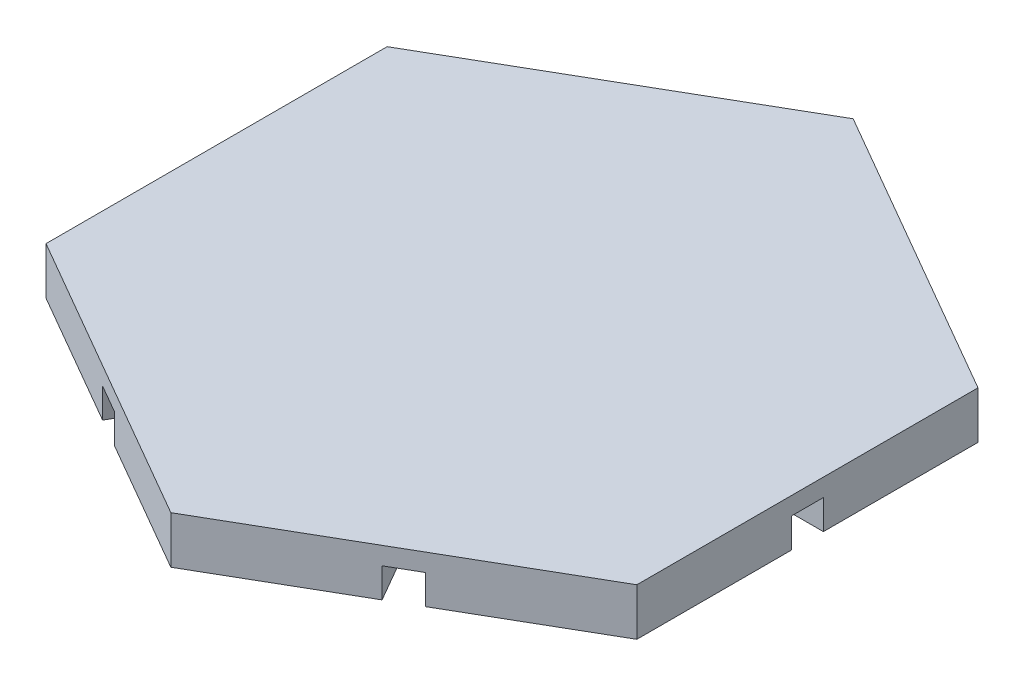
ISO-10303-21;
HEADER;
FILE_DESCRIPTION(('STEP AP214'),'2;1');
FILE_NAME('part.step','',(''),(''),'','','');
FILE_SCHEMA(('AUTOMOTIVE_DESIGN { 1 0 10303 214 1 1 1 1 }'));
ENDSEC;
DATA;
#1=APPLICATION_CONTEXT('core data for automotive mechanical design processes');
#2=APPLICATION_PROTOCOL_DEFINITION('international standard','automotive_design',2000,#1);
#3=PRODUCT_CONTEXT('',#1,'mechanical');
#4=PRODUCT('Part','Part','',(#3));
#5=PRODUCT_RELATED_PRODUCT_CATEGORY('part','',(#4));
#6=PRODUCT_DEFINITION_FORMATION('','',#4);
#7=PRODUCT_DEFINITION_CONTEXT('part definition',#1,'design');
#8=PRODUCT_DEFINITION('design','',#6,#7);
#9=PRODUCT_DEFINITION_SHAPE('','',#8);
#10=(LENGTH_UNIT() NAMED_UNIT(*) SI_UNIT(.MILLI.,.METRE.));
#11=(NAMED_UNIT(*) PLANE_ANGLE_UNIT() SI_UNIT($,.RADIAN.));
#12=(NAMED_UNIT(*) SI_UNIT($,.STERADIAN.) SOLID_ANGLE_UNIT());
#13=UNCERTAINTY_MEASURE_WITH_UNIT(LENGTH_MEASURE(1.E-05),#10,'distance_accuracy_value','');
#14=(GEOMETRIC_REPRESENTATION_CONTEXT(3) GLOBAL_UNCERTAINTY_ASSIGNED_CONTEXT((#13)) GLOBAL_UNIT_ASSIGNED_CONTEXT((#10,
#11,#12)) REPRESENTATION_CONTEXT('',''));
#15=CARTESIAN_POINT('',(0.,0.,0.));
#16=DIRECTION('',(0.,0.,1.));
#17=DIRECTION('',(1.,0.,0.));
#18=AXIS2_PLACEMENT_3D('',#15,#16,#17);
#19=CARTESIAN_POINT('',(25.,8.,43.3012701892219));
#20=DIRECTION('',(-0.499999999999999,0.,-0.866025403784439));
#21=DIRECTION('',(-0.866025403784439,0.,0.499999999999999));
#22=AXIS2_PLACEMENT_3D('',#19,#20,#21);
#23=PLANE('',#22);
#24=DIRECTION('',(0.,-1.,0.));
#25=VECTOR('',#24,1.);
#26=CARTESIAN_POINT('',(27.338268590218,5.,41.9512701892219));
#27=LINE('',#26,#25);
#28=CARTESIAN_POINT('',(27.338268590218,5.,41.9512701892219));
#29=VERTEX_POINT('',#28);
#30=CARTESIAN_POINT('',(27.338268590218,0.,41.9512701892219));
#31=VERTEX_POINT('',#30);
#32=EDGE_CURVE('E300',#29,#31,#27,.T.);
#33=ORIENTED_EDGE('',*,*,#32,.T.);
#34=DIRECTION('',(0.866025403784439,0.,-0.499999999999999));
#35=VECTOR('',#34,1.);
#36=CARTESIAN_POINT('',(25.,0.,43.3012701892219));
#37=LINE('',#36,#35);
#38=CARTESIAN_POINT('',(50.,0.,28.8675134594813));
#39=VERTEX_POINT('',#38);
#40=EDGE_CURVE('E171',#31,#39,#37,.T.);
#41=ORIENTED_EDGE('',*,*,#40,.T.);
#42=DIRECTION('',(0.,-1.,0.));
#43=VECTOR('',#42,1.);
#44=CARTESIAN_POINT('',(50.,8.,28.8675134594813));
#45=LINE('',#44,#43);
#46=CARTESIAN_POINT('',(50.,8.,28.8675134594813));
#47=VERTEX_POINT('',#46);
#48=EDGE_CURVE('E220',#47,#39,#45,.T.);
#49=ORIENTED_EDGE('',*,*,#48,.F.);
#50=DIRECTION('',(0.866025403784439,0.,-0.499999999999999));
#51=VECTOR('',#50,1.);
#52=CARTESIAN_POINT('',(25.,8.,43.3012701892219));
#53=LINE('',#52,#51);
#54=CARTESIAN_POINT('',(0.,8.,57.7350269189626));
#55=VERTEX_POINT('',#54);
#56=EDGE_CURVE('E144',#55,#47,#53,.T.);
#57=ORIENTED_EDGE('',*,*,#56,.F.);
#58=DIRECTION('',(0.,-1.,0.));
#59=VECTOR('',#58,1.);
#60=CARTESIAN_POINT('',(0.,8.,57.7350269189626));
#61=LINE('',#60,#59);
#62=CARTESIAN_POINT('',(0.,0.,57.7350269189626));
#63=VERTEX_POINT('',#62);
#64=EDGE_CURVE('E213',#55,#63,#61,.T.);
#65=ORIENTED_EDGE('',*,*,#64,.T.);
#66=CARTESIAN_POINT('',(22.661731409782,0.,44.6512701892219));
#67=VERTEX_POINT('',#66);
#68=EDGE_CURVE('E247',#63,#67,#37,.T.);
#69=ORIENTED_EDGE('',*,*,#68,.T.);
#70=DIRECTION('',(0.,-1.,0.));
#71=VECTOR('',#70,1.);
#72=CARTESIAN_POINT('',(22.661731409782,5.,44.6512701892219));
#73=LINE('',#72,#71);
#74=CARTESIAN_POINT('',(22.661731409782,5.,44.6512701892219));
#75=VERTEX_POINT('',#74);
#76=EDGE_CURVE('E295',#75,#67,#73,.T.);
#77=ORIENTED_EDGE('',*,*,#76,.F.);
#78=DIRECTION('',(0.866025403784439,0.,-0.499999999999999));
#79=VECTOR('',#78,1.);
#80=CARTESIAN_POINT('',(22.661731409782,5.,44.6512701892219));
#81=LINE('',#80,#79);
#82=EDGE_CURVE('E310',#75,#29,#81,.T.);
#83=ORIENTED_EDGE('',*,*,#82,.T.);
#84=EDGE_LOOP('',(#33,#41,#49,#57,#65,#69,#77,#83));
#85=FACE_BOUND('',#84,.T.);
#86=ADVANCED_FACE('F119',(#85),#23,.F.);
#87=CARTESIAN_POINT('',(0.,0.,0.));
#88=DIRECTION('',(0.,1.,0.));
#89=DIRECTION('',(0.,0.,1.));
#90=AXIS2_PLACEMENT_3D('',#87,#88,#89);
#91=PLANE('',#90);
#92=DIRECTION('',(-0.5,0.,-0.866025403784439));
#93=VECTOR('',#92,1.);
#94=CARTESIAN_POINT('',(27.338268590218,0.,41.9512701892219));
#95=LINE('',#94,#93);
#96=CARTESIAN_POINT('',(4.67653718043595,0.,2.7));
#97=VERTEX_POINT('',#96);
#98=EDGE_CURVE('E283',#31,#97,#95,.T.);
#99=ORIENTED_EDGE('',*,*,#98,.T.);
#100=DIRECTION('',(-1.,0.,0.));
#101=VECTOR('',#100,1.);
#102=CARTESIAN_POINT('',(50.,0.,2.7));
#103=LINE('',#102,#101);
#104=CARTESIAN_POINT('',(50.,0.,2.7));
#105=VERTEX_POINT('',#104);
#106=EDGE_CURVE('E438',#105,#97,#103,.T.);
#107=ORIENTED_EDGE('',*,*,#106,.F.);
#108=DIRECTION('',(0.,0.,-1.));
#109=VECTOR('',#108,1.);
#110=CARTESIAN_POINT('',(50.,0.,0.));
#111=LINE('',#110,#109);
#112=EDGE_CURVE('E224',#39,#105,#111,.T.);
#113=ORIENTED_EDGE('',*,*,#112,.F.);
#114=ORIENTED_EDGE('',*,*,#40,.F.);
#115=EDGE_LOOP('',(#99,#107,#113,#114));
#116=FACE_BOUND('',#115,.T.);
#117=ADVANCED_FACE('F593',(#116),#91,.F.);
#118=DIRECTION('',(0.5,0.,-0.866025403784439));
#119=VECTOR('',#118,1.);
#120=CARTESIAN_POINT('',(-22.661731409782,0.,44.6512701892219));
#121=LINE('',#120,#119);
#122=CARTESIAN_POINT('',(4.67653718043596,0.,-2.7));
#123=VERTEX_POINT('',#122);
#124=CARTESIAN_POINT('',(27.338268590218,0.,-41.9512701892219));
#125=VERTEX_POINT('',#124);
#126=EDGE_CURVE('E348',#123,#125,#121,.T.);
#127=ORIENTED_EDGE('',*,*,#126,.T.);
#128=DIRECTION('',(-0.866025403784438,0.,-0.5));
#129=VECTOR('',#128,1.);
#130=CARTESIAN_POINT('',(25.,0.,-43.3012701892219));
#131=LINE('',#130,#129);
#132=CARTESIAN_POINT('',(50.,0.,-28.8675134594813));
#133=VERTEX_POINT('',#132);
#134=EDGE_CURVE('E230',#133,#125,#131,.T.);
#135=ORIENTED_EDGE('',*,*,#134,.F.);
#136=CARTESIAN_POINT('',(50.,0.,-2.7));
#137=VERTEX_POINT('',#136);
#138=EDGE_CURVE('E229',#137,#133,#111,.T.);
#139=ORIENTED_EDGE('',*,*,#138,.F.);
#140=DIRECTION('',(-1.,0.,0.));
#141=VECTOR('',#140,1.);
#142=CARTESIAN_POINT('',(50.,0.,-2.7));
#143=LINE('',#142,#141);
#144=EDGE_CURVE('E432',#137,#123,#143,.T.);
#145=ORIENTED_EDGE('',*,*,#144,.T.);
#146=EDGE_LOOP('',(#127,#135,#139,#145));
#147=FACE_BOUND('',#146,.T.);
#148=ADVANCED_FACE('F599',(#147),#91,.F.);
#149=CARTESIAN_POINT('',(-22.661731409782,0.,44.6512701892219));
#150=VERTEX_POINT('',#149);
#151=CARTESIAN_POINT('',(0.,0.,5.40000000000001));
#152=VERTEX_POINT('',#151);
#153=EDGE_CURVE('E349',#150,#152,#121,.T.);
#154=ORIENTED_EDGE('',*,*,#153,.T.);
#155=DIRECTION('',(-0.5,0.,-0.866025403784439));
#156=VECTOR('',#155,1.);
#157=CARTESIAN_POINT('',(22.661731409782,0.,44.6512701892219));
#158=LINE('',#157,#156);
#159=EDGE_CURVE('E284',#67,#152,#158,.T.);
#160=ORIENTED_EDGE('',*,*,#159,.F.);
#161=ORIENTED_EDGE('',*,*,#68,.F.);
#162=DIRECTION('',(0.866025403784439,0.,0.5));
#163=VECTOR('',#162,1.);
#164=CARTESIAN_POINT('',(-25.,0.,43.3012701892219));
#165=LINE('',#164,#163);
#166=EDGE_CURVE('E243',#150,#63,#165,.T.);
#167=ORIENTED_EDGE('',*,*,#166,.F.);
#168=EDGE_LOOP('',(#154,#160,#161,#167));
#169=FACE_BOUND('',#168,.T.);
#170=ADVANCED_FACE('F558',(#169),#91,.F.);
#171=CARTESIAN_POINT('',(22.661731409782,0.,-44.651270189222));
#172=VERTEX_POINT('',#171);
#173=CARTESIAN_POINT('',(0.,0.,-57.7350269189626));
#174=VERTEX_POINT('',#173);
#175=EDGE_CURVE('E228',#172,#174,#131,.T.);
#176=ORIENTED_EDGE('',*,*,#175,.F.);
#177=DIRECTION('',(0.5,0.,-0.866025403784439));
#178=VECTOR('',#177,1.);
#179=CARTESIAN_POINT('',(-27.338268590218,0.,41.9512701892219));
#180=LINE('',#179,#178);
#181=CARTESIAN_POINT('',(0.,0.,-5.39999999999999));
#182=VERTEX_POINT('',#181);
#183=EDGE_CURVE('E275',#182,#172,#180,.T.);
#184=ORIENTED_EDGE('',*,*,#183,.F.);
#185=CARTESIAN_POINT('',(-22.661731409782,0.,-44.651270189222));
#186=VERTEX_POINT('',#185);
#187=EDGE_CURVE('E272',#182,#186,#95,.T.);
#188=ORIENTED_EDGE('',*,*,#187,.T.);
#189=DIRECTION('',(-0.866025403784439,0.,0.5));
#190=VECTOR('',#189,1.);
#191=CARTESIAN_POINT('',(-25.,0.,-43.3012701892219));
#192=LINE('',#191,#190);
#193=EDGE_CURVE('E235',#174,#186,#192,.T.);
#194=ORIENTED_EDGE('',*,*,#193,.F.);
#195=EDGE_LOOP('',(#176,#184,#188,#194));
#196=FACE_BOUND('',#195,.T.);
#197=ADVANCED_FACE('F268',(#196),#91,.F.);
#198=CARTESIAN_POINT('',(-4.67653718043598,0.,2.7));
#199=VERTEX_POINT('',#198);
#200=CARTESIAN_POINT('',(-50.,0.,2.7));
#201=VERTEX_POINT('',#200);
#202=EDGE_CURVE('E442',#199,#201,#103,.T.);
#203=ORIENTED_EDGE('',*,*,#202,.F.);
#204=CARTESIAN_POINT('',(-27.338268590218,0.,41.9512701892219));
#205=VERTEX_POINT('',#204);
#206=EDGE_CURVE('E344',#205,#199,#180,.T.);
#207=ORIENTED_EDGE('',*,*,#206,.F.);
#208=CARTESIAN_POINT('',(-50.,0.,28.8675134594813));
#209=VERTEX_POINT('',#208);
#210=EDGE_CURVE('E244',#209,#205,#165,.T.);
#211=ORIENTED_EDGE('',*,*,#210,.F.);
#212=DIRECTION('',(0.,0.,1.));
#213=VECTOR('',#212,1.);
#214=CARTESIAN_POINT('',(-50.,0.,0.));
#215=LINE('',#214,#213);
#216=EDGE_CURVE('E207',#201,#209,#215,.T.);
#217=ORIENTED_EDGE('',*,*,#216,.F.);
#218=EDGE_LOOP('',(#203,#207,#211,#217));
#219=FACE_BOUND('',#218,.T.);
#220=ADVANCED_FACE('F565',(#219),#91,.F.);
#221=CARTESIAN_POINT('',(50.,8.,0.));
#222=DIRECTION('',(-1.,0.,0.));
#223=DIRECTION('',(0.,0.,1.));
#224=AXIS2_PLACEMENT_3D('',#221,#222,#223);
#225=PLANE('',#224);
#226=ORIENTED_EDGE('',*,*,#112,.T.);
#227=DIRECTION('',(0.,-1.,0.));
#228=VECTOR('',#227,1.);
#229=CARTESIAN_POINT('',(50.,5.,2.7));
#230=LINE('',#229,#228);
#231=CARTESIAN_POINT('',(50.,5.,2.7));
#232=VERTEX_POINT('',#231);
#233=EDGE_CURVE('E418',#232,#105,#230,.T.);
#234=ORIENTED_EDGE('',*,*,#233,.F.);
#235=DIRECTION('',(0.,0.,-1.));
#236=VECTOR('',#235,1.);
#237=CARTESIAN_POINT('',(50.,5.,2.7));
#238=LINE('',#237,#236);
#239=CARTESIAN_POINT('',(50.,5.,-2.7));
#240=VERTEX_POINT('',#239);
#241=EDGE_CURVE('E422',#232,#240,#238,.T.);
#242=ORIENTED_EDGE('',*,*,#241,.T.);
#243=DIRECTION('',(0.,-1.,0.));
#244=VECTOR('',#243,1.);
#245=CARTESIAN_POINT('',(50.,5.,-2.7));
#246=LINE('',#245,#244);
#247=EDGE_CURVE('E425',#240,#137,#246,.T.);
#248=ORIENTED_EDGE('',*,*,#247,.T.);
#249=ORIENTED_EDGE('',*,*,#138,.T.);
#250=DIRECTION('',(0.,-1.,0.));
#251=VECTOR('',#250,1.);
#252=CARTESIAN_POINT('',(50.,8.,-28.8675134594813));
#253=LINE('',#252,#251);
#254=CARTESIAN_POINT('',(50.,8.,-28.8675134594813));
#255=VERTEX_POINT('',#254);
#256=EDGE_CURVE('E12',#255,#133,#253,.T.);
#257=ORIENTED_EDGE('',*,*,#256,.F.);
#258=DIRECTION('',(0.,0.,-1.));
#259=VECTOR('',#258,1.);
#260=CARTESIAN_POINT('',(50.,8.,0.));
#261=LINE('',#260,#259);
#262=EDGE_CURVE('E251',#47,#255,#261,.T.);
#263=ORIENTED_EDGE('',*,*,#262,.F.);
#264=ORIENTED_EDGE('',*,*,#48,.T.);
#265=EDGE_LOOP('',(#226,#234,#242,#248,#249,#257,#263,#264));
#266=FACE_BOUND('',#265,.T.);
#267=ADVANCED_FACE('F121',(#266),#225,.F.);
#268=CARTESIAN_POINT('',(25.,8.,-43.3012701892219));
#269=DIRECTION('',(-0.5,0.,0.866025403784438));
#270=DIRECTION('',(0.866025403784438,0.,0.5));
#271=AXIS2_PLACEMENT_3D('',#268,#269,#270);
#272=PLANE('',#271);
#273=DIRECTION('',(-0.866025403784438,0.,-0.500000000000001));
#274=VECTOR('',#273,1.);
#275=CARTESIAN_POINT('',(27.338268590218,5.,-41.9512701892219));
#276=LINE('',#275,#274);
#277=CARTESIAN_POINT('',(27.338268590218,5.,-41.9512701892219));
#278=VERTEX_POINT('',#277);
#279=CARTESIAN_POINT('',(22.661731409782,5.,-44.651270189222));
#280=VERTEX_POINT('',#279);
#281=EDGE_CURVE('E329',#278,#280,#276,.T.);
#282=ORIENTED_EDGE('',*,*,#281,.T.);
#283=DIRECTION('',(0.,-1.,0.));
#284=VECTOR('',#283,1.);
#285=CARTESIAN_POINT('',(22.661731409782,5.,-44.651270189222));
#286=LINE('',#285,#284);
#287=EDGE_CURVE('E343',#280,#172,#286,.T.);
#288=ORIENTED_EDGE('',*,*,#287,.T.);
#289=ORIENTED_EDGE('',*,*,#175,.T.);
#290=DIRECTION('',(0.,-1.,0.));
#291=VECTOR('',#290,1.);
#292=CARTESIAN_POINT('',(0.,8.,-57.7350269189626));
#293=LINE('',#292,#291);
#294=CARTESIAN_POINT('',(0.,8.,-57.7350269189626));
#295=VERTEX_POINT('',#294);
#296=EDGE_CURVE('E128',#295,#174,#293,.T.);
#297=ORIENTED_EDGE('',*,*,#296,.F.);
#298=DIRECTION('',(-0.866025403784438,0.,-0.5));
#299=VECTOR('',#298,1.);
#300=CARTESIAN_POINT('',(25.,8.,-43.3012701892219));
#301=LINE('',#300,#299);
#302=EDGE_CURVE('E179',#255,#295,#301,.T.);
#303=ORIENTED_EDGE('',*,*,#302,.F.);
#304=ORIENTED_EDGE('',*,*,#256,.T.);
#305=ORIENTED_EDGE('',*,*,#134,.T.);
#306=DIRECTION('',(0.,-1.,0.));
#307=VECTOR('',#306,1.);
#308=CARTESIAN_POINT('',(27.338268590218,5.,-41.9512701892219));
#309=LINE('',#308,#307);
#310=EDGE_CURVE('E361',#278,#125,#309,.T.);
#311=ORIENTED_EDGE('',*,*,#310,.F.);
#312=EDGE_LOOP('',(#282,#288,#289,#297,#303,#304,#305,#311));
#313=FACE_BOUND('',#312,.T.);
#314=ADVANCED_FACE('F609',(#313),#272,.F.);
#315=CARTESIAN_POINT('',(-25.,8.,-43.3012701892219));
#316=DIRECTION('',(0.5,0.,0.866025403784439));
#317=DIRECTION('',(0.866025403784439,0.,-0.5));
#318=AXIS2_PLACEMENT_3D('',#315,#316,#317);
#319=PLANE('',#318);
#320=DIRECTION('',(-0.866025403784439,0.,0.499999999999999));
#321=VECTOR('',#320,1.);
#322=CARTESIAN_POINT('',(-22.661731409782,5.,-44.651270189222));
#323=LINE('',#322,#321);
#324=CARTESIAN_POINT('',(-22.661731409782,5.,-44.651270189222));
#325=VERTEX_POINT('',#324);
#326=CARTESIAN_POINT('',(-27.338268590218,5.,-41.951270189222));
#327=VERTEX_POINT('',#326);
#328=EDGE_CURVE('E395',#325,#327,#323,.T.);
#329=ORIENTED_EDGE('',*,*,#328,.T.);
#330=DIRECTION('',(0.,-1.,0.));
#331=VECTOR('',#330,1.);
#332=CARTESIAN_POINT('',(-27.338268590218,5.,-41.951270189222));
#333=LINE('',#332,#331);
#334=CARTESIAN_POINT('',(-27.338268590218,0.,-41.951270189222));
#335=VERTEX_POINT('',#334);
#336=EDGE_CURVE('E306',#327,#335,#333,.T.);
#337=ORIENTED_EDGE('',*,*,#336,.T.);
#338=CARTESIAN_POINT('',(-50.,0.,-28.8675134594813));
#339=VERTEX_POINT('',#338);
#340=EDGE_CURVE('E234',#335,#339,#192,.T.);
#341=ORIENTED_EDGE('',*,*,#340,.T.);
#342=DIRECTION('',(0.,-1.,0.));
#343=VECTOR('',#342,1.);
#344=CARTESIAN_POINT('',(-50.,8.,-28.8675134594813));
#345=LINE('',#344,#343);
#346=CARTESIAN_POINT('',(-50.,8.,-28.8675134594813));
#347=VERTEX_POINT('',#346);
#348=EDGE_CURVE('E212',#347,#339,#345,.T.);
#349=ORIENTED_EDGE('',*,*,#348,.F.);
#350=DIRECTION('',(-0.866025403784439,0.,0.5));
#351=VECTOR('',#350,1.);
#352=CARTESIAN_POINT('',(-25.,8.,-43.3012701892219));
#353=LINE('',#352,#351);
#354=EDGE_CURVE('E195',#295,#347,#353,.T.);
#355=ORIENTED_EDGE('',*,*,#354,.F.);
#356=ORIENTED_EDGE('',*,*,#296,.T.);
#357=ORIENTED_EDGE('',*,*,#193,.T.);
#358=DIRECTION('',(0.,-1.,0.));
#359=VECTOR('',#358,1.);
#360=CARTESIAN_POINT('',(-22.661731409782,5.,-44.651270189222));
#361=LINE('',#360,#359);
#362=EDGE_CURVE('E303',#325,#186,#361,.T.);
#363=ORIENTED_EDGE('',*,*,#362,.F.);
#364=EDGE_LOOP('',(#329,#337,#341,#349,#355,#356,#357,#363));
#365=FACE_BOUND('',#364,.T.);
#366=ADVANCED_FACE('F262',(#365),#319,.F.);
#367=CARTESIAN_POINT('',(-50.,8.,0.));
#368=DIRECTION('',(1.,0.,0.));
#369=DIRECTION('',(0.,0.,-1.));
#370=AXIS2_PLACEMENT_3D('',#367,#368,#369);
#371=PLANE('',#370);
#372=DIRECTION('',(0.,0.,1.));
#373=VECTOR('',#372,1.);
#374=CARTESIAN_POINT('',(-50.,5.,-2.7));
#375=LINE('',#374,#373);
#376=CARTESIAN_POINT('',(-50.,5.,-2.7));
#377=VERTEX_POINT('',#376);
#378=CARTESIAN_POINT('',(-50.,5.,2.7));
#379=VERTEX_POINT('',#378);
#380=EDGE_CURVE('E451',#377,#379,#375,.T.);
#381=ORIENTED_EDGE('',*,*,#380,.T.);
#382=DIRECTION('',(0.,-1.,0.));
#383=VECTOR('',#382,1.);
#384=CARTESIAN_POINT('',(-50.,5.,2.7));
#385=LINE('',#384,#383);
#386=EDGE_CURVE('E419',#379,#201,#385,.T.);
#387=ORIENTED_EDGE('',*,*,#386,.T.);
#388=ORIENTED_EDGE('',*,*,#216,.T.);
#389=DIRECTION('',(0.,-1.,0.));
#390=VECTOR('',#389,1.);
#391=CARTESIAN_POINT('',(-50.,8.,28.8675134594813));
#392=LINE('',#391,#390);
#393=CARTESIAN_POINT('',(-50.,8.,28.8675134594813));
#394=VERTEX_POINT('',#393);
#395=EDGE_CURVE('E202',#394,#209,#392,.T.);
#396=ORIENTED_EDGE('',*,*,#395,.F.);
#397=DIRECTION('',(0.,0.,1.));
#398=VECTOR('',#397,1.);
#399=CARTESIAN_POINT('',(-50.,8.,0.));
#400=LINE('',#399,#398);
#401=EDGE_CURVE('E188',#347,#394,#400,.T.);
#402=ORIENTED_EDGE('',*,*,#401,.F.);
#403=ORIENTED_EDGE('',*,*,#348,.T.);
#404=CARTESIAN_POINT('',(-50.,0.,-2.7));
#405=VERTEX_POINT('',#404);
#406=EDGE_CURVE('E239',#339,#405,#215,.T.);
#407=ORIENTED_EDGE('',*,*,#406,.T.);
#408=DIRECTION('',(0.,-1.,0.));
#409=VECTOR('',#408,1.);
#410=CARTESIAN_POINT('',(-50.,5.,-2.7));
#411=LINE('',#410,#409);
#412=EDGE_CURVE('E135',#377,#405,#411,.T.);
#413=ORIENTED_EDGE('',*,*,#412,.F.);
#414=EDGE_LOOP('',(#381,#387,#388,#396,#402,#403,#407,#413));
#415=FACE_BOUND('',#414,.T.);
#416=ADVANCED_FACE('F204',(#415),#371,.F.);
#417=CARTESIAN_POINT('',(-25.,8.,43.3012701892219));
#418=DIRECTION('',(0.5,0.,-0.866025403784439));
#419=DIRECTION('',(-0.866025403784439,0.,-0.5));
#420=AXIS2_PLACEMENT_3D('',#417,#418,#419);
#421=PLANE('',#420);
#422=ORIENTED_EDGE('',*,*,#210,.T.);
#423=DIRECTION('',(0.,-1.,0.));
#424=VECTOR('',#423,1.);
#425=CARTESIAN_POINT('',(-27.338268590218,5.,41.9512701892219));
#426=LINE('',#425,#424);
#427=CARTESIAN_POINT('',(-27.338268590218,5.,41.9512701892219));
#428=VERTEX_POINT('',#427);
#429=EDGE_CURVE('E353',#428,#205,#426,.T.);
#430=ORIENTED_EDGE('',*,*,#429,.F.);
#431=DIRECTION('',(0.866025403784438,0.,0.500000000000001));
#432=VECTOR('',#431,1.);
#433=CARTESIAN_POINT('',(-27.338268590218,5.,41.9512701892219));
#434=LINE('',#433,#432);
#435=CARTESIAN_POINT('',(-22.661731409782,5.,44.6512701892219));
#436=VERTEX_POINT('',#435);
#437=EDGE_CURVE('E339',#428,#436,#434,.T.);
#438=ORIENTED_EDGE('',*,*,#437,.T.);
#439=DIRECTION('',(0.,-1.,0.));
#440=VECTOR('',#439,1.);
#441=CARTESIAN_POINT('',(-22.661731409782,5.,44.6512701892219));
#442=LINE('',#441,#440);
#443=EDGE_CURVE('E357',#436,#150,#442,.T.);
#444=ORIENTED_EDGE('',*,*,#443,.T.);
#445=ORIENTED_EDGE('',*,*,#166,.T.);
#446=ORIENTED_EDGE('',*,*,#64,.F.);
#447=DIRECTION('',(0.866025403784439,0.,0.5));
#448=VECTOR('',#447,1.);
#449=CARTESIAN_POINT('',(-25.,8.,43.3012701892219));
#450=LINE('',#449,#448);
#451=EDGE_CURVE('E192',#394,#55,#450,.T.);
#452=ORIENTED_EDGE('',*,*,#451,.F.);
#453=ORIENTED_EDGE('',*,*,#395,.T.);
#454=EDGE_LOOP('',(#422,#430,#438,#444,#445,#446,#452,#453));
#455=FACE_BOUND('',#454,.T.);
#456=ADVANCED_FACE('F215',(#455),#421,.F.);
#457=CARTESIAN_POINT('',(0.,8.,0.));
#458=DIRECTION('',(0.,1.,0.));
#459=DIRECTION('',(0.,0.,1.));
#460=AXIS2_PLACEMENT_3D('',#457,#458,#459);
#461=PLANE('',#460);
#462=ORIENTED_EDGE('',*,*,#262,.T.);
#463=ORIENTED_EDGE('',*,*,#302,.T.);
#464=ORIENTED_EDGE('',*,*,#354,.T.);
#465=ORIENTED_EDGE('',*,*,#401,.T.);
#466=ORIENTED_EDGE('',*,*,#451,.T.);
#467=ORIENTED_EDGE('',*,*,#56,.T.);
#468=EDGE_LOOP('',(#462,#463,#464,#465,#466,#467));
#469=FACE_BOUND('',#468,.T.);
#470=ADVANCED_FACE('F190',(#469),#461,.T.);
#471=ORIENTED_EDGE('',*,*,#340,.F.);
#472=CARTESIAN_POINT('',(-4.67653718043598,0.,-2.7));
#473=VERTEX_POINT('',#472);
#474=EDGE_CURVE('E291',#473,#335,#158,.T.);
#475=ORIENTED_EDGE('',*,*,#474,.F.);
#476=EDGE_CURVE('E437',#473,#405,#143,.T.);
#477=ORIENTED_EDGE('',*,*,#476,.T.);
#478=ORIENTED_EDGE('',*,*,#406,.F.);
#479=EDGE_LOOP('',(#471,#475,#477,#478));
#480=FACE_BOUND('',#479,.T.);
#481=ADVANCED_FACE('F571',(#480),#91,.F.);
#482=CARTESIAN_POINT('',(-27.338268590218,5.,41.9512701892219));
#483=DIRECTION('',(-0.866025403784438,0.,-0.5));
#484=DIRECTION('',(-0.5,0.,0.866025403784438));
#485=AXIS2_PLACEMENT_3D('',#482,#483,#484);
#486=PLANE('',#485);
#487=ORIENTED_EDGE('',*,*,#183,.T.);
#488=ORIENTED_EDGE('',*,*,#287,.F.);
#489=DIRECTION('',(0.5,0.,-0.866025403784439));
#490=VECTOR('',#489,1.);
#491=CARTESIAN_POINT('',(-27.338268590218,5.,41.9512701892219));
#492=LINE('',#491,#490);
#493=CARTESIAN_POINT('',(0.,5.,-5.39999999999999));
#494=VERTEX_POINT('',#493);
#495=EDGE_CURVE('E330',#494,#280,#492,.T.);
#496=ORIENTED_EDGE('',*,*,#495,.F.);
#497=DIRECTION('',(0.,1.,0.));
#498=VECTOR('',#497,1.);
#499=CARTESIAN_POINT('',(0.,5.,-5.4));
#500=LINE('',#499,#498);
#501=EDGE_CURVE('E322',#182,#494,#500,.T.);
#502=ORIENTED_EDGE('',*,*,#501,.F.);
#503=EDGE_LOOP('',(#487,#488,#496,#502));
#504=FACE_BOUND('',#503,.T.);
#505=ADVANCED_FACE('F704',(#504),#486,.F.);
#506=CARTESIAN_POINT('',(-22.661731409782,5.,44.6512701892219));
#507=DIRECTION('',(-0.866025403784438,0.,-0.5));
#508=DIRECTION('',(-0.5,0.,0.866025403784438));
#509=AXIS2_PLACEMENT_3D('',#506,#507,#508);
#510=PLANE('',#509);
#511=DIRECTION('',(0.,1.,0.));
#512=VECTOR('',#511,1.);
#513=CARTESIAN_POINT('',(4.67653718043596,5.,-2.7));
#514=LINE('',#513,#512);
#515=CARTESIAN_POINT('',(4.67653718043595,5.,-2.7));
#516=VERTEX_POINT('',#515);
#517=EDGE_CURVE('E314',#123,#516,#514,.T.);
#518=ORIENTED_EDGE('',*,*,#517,.T.);
#519=DIRECTION('',(0.5,0.,-0.866025403784439));
#520=VECTOR('',#519,1.);
#521=CARTESIAN_POINT('',(-22.661731409782,5.,44.6512701892219));
#522=LINE('',#521,#520);
#523=EDGE_CURVE('E334',#516,#278,#522,.T.);
#524=ORIENTED_EDGE('',*,*,#523,.T.);
#525=ORIENTED_EDGE('',*,*,#310,.T.);
#526=ORIENTED_EDGE('',*,*,#126,.F.);
#527=EDGE_LOOP('',(#518,#524,#525,#526));
#528=FACE_BOUND('',#527,.T.);
#529=ADVANCED_FACE('F619',(#528),#510,.T.);
#530=DIRECTION('',(0.,1.,0.));
#531=VECTOR('',#530,1.);
#532=CARTESIAN_POINT('',(-4.67653718043598,5.,2.7));
#533=LINE('',#532,#531);
#534=CARTESIAN_POINT('',(-4.67653718043598,5.,2.7));
#535=VERTEX_POINT('',#534);
#536=EDGE_CURVE('E299',#199,#535,#533,.T.);
#537=ORIENTED_EDGE('',*,*,#536,.T.);
#538=EDGE_CURVE('E325',#428,#535,#492,.T.);
#539=ORIENTED_EDGE('',*,*,#538,.F.);
#540=ORIENTED_EDGE('',*,*,#429,.T.);
#541=ORIENTED_EDGE('',*,*,#206,.T.);
#542=EDGE_LOOP('',(#537,#539,#540,#541));
#543=FACE_BOUND('',#542,.T.);
#544=ADVANCED_FACE('F562',(#543),#486,.F.);
#545=ORIENTED_EDGE('',*,*,#153,.F.);
#546=ORIENTED_EDGE('',*,*,#443,.F.);
#547=CARTESIAN_POINT('',(0.,5.,5.40000000000001));
#548=VERTEX_POINT('',#547);
#549=EDGE_CURVE('E335',#436,#548,#522,.T.);
#550=ORIENTED_EDGE('',*,*,#549,.T.);
#551=DIRECTION('',(0.,1.,0.));
#552=VECTOR('',#551,1.);
#553=CARTESIAN_POINT('',(0.,5.,5.4));
#554=LINE('',#553,#552);
#555=EDGE_CURVE('E318',#152,#548,#554,.T.);
#556=ORIENTED_EDGE('',*,*,#555,.F.);
#557=EDGE_LOOP('',(#545,#546,#550,#556));
#558=FACE_BOUND('',#557,.T.);
#559=ADVANCED_FACE('F555',(#558),#510,.T.);
#560=CARTESIAN_POINT('',(0.,5.,0.));
#561=DIRECTION('',(0.,1.,0.));
#562=DIRECTION('',(-1.,0.,0.));
#563=AXIS2_PLACEMENT_3D('',#560,#561,#562);
#564=PLANE('',#563);
#565=ORIENTED_EDGE('',*,*,#549,.F.);
#566=ORIENTED_EDGE('',*,*,#437,.F.);
#567=ORIENTED_EDGE('',*,*,#538,.T.);
#568=DIRECTION('',(-1.,0.,0.));
#569=VECTOR('',#568,1.);
#570=CARTESIAN_POINT('',(50.,5.,2.7));
#571=LINE('',#570,#569);
#572=EDGE_CURVE('E436',#535,#379,#571,.T.);
#573=ORIENTED_EDGE('',*,*,#572,.T.);
#574=ORIENTED_EDGE('',*,*,#380,.F.);
#575=DIRECTION('',(-1.,0.,0.));
#576=VECTOR('',#575,1.);
#577=CARTESIAN_POINT('',(50.,5.,-2.7));
#578=LINE('',#577,#576);
#579=CARTESIAN_POINT('',(-4.67653718043598,5.,-2.7));
#580=VERTEX_POINT('',#579);
#581=EDGE_CURVE('E450',#580,#377,#578,.T.);
#582=ORIENTED_EDGE('',*,*,#581,.F.);
#583=DIRECTION('',(-0.5,0.,-0.866025403784439));
#584=VECTOR('',#583,1.);
#585=CARTESIAN_POINT('',(22.661731409782,5.,44.6512701892219));
#586=LINE('',#585,#584);
#587=EDGE_CURVE('E289',#580,#327,#586,.T.);
#588=ORIENTED_EDGE('',*,*,#587,.T.);
#589=ORIENTED_EDGE('',*,*,#328,.F.);
#590=DIRECTION('',(-0.5,0.,-0.866025403784439));
#591=VECTOR('',#590,1.);
#592=CARTESIAN_POINT('',(27.338268590218,5.,41.9512701892219));
#593=LINE('',#592,#591);
#594=EDGE_CURVE('E391',#494,#325,#593,.T.);
#595=ORIENTED_EDGE('',*,*,#594,.F.);
#596=ORIENTED_EDGE('',*,*,#495,.T.);
#597=ORIENTED_EDGE('',*,*,#281,.F.);
#598=ORIENTED_EDGE('',*,*,#523,.F.);
#599=EDGE_CURVE('E446',#240,#516,#578,.T.);
#600=ORIENTED_EDGE('',*,*,#599,.F.);
#601=ORIENTED_EDGE('',*,*,#241,.F.);
#602=CARTESIAN_POINT('',(4.67653718043595,5.,2.7));
#603=VERTEX_POINT('',#602);
#604=EDGE_CURVE('E454',#232,#603,#571,.T.);
#605=ORIENTED_EDGE('',*,*,#604,.T.);
#606=EDGE_CURVE('E388',#29,#603,#593,.T.);
#607=ORIENTED_EDGE('',*,*,#606,.F.);
#608=ORIENTED_EDGE('',*,*,#82,.F.);
#609=EDGE_CURVE('E397',#75,#548,#586,.T.);
#610=ORIENTED_EDGE('',*,*,#609,.T.);
#611=EDGE_LOOP('',(#565,#566,#567,#573,#574,#582,#588,#589,#595,#596,#597,#598,#600,#601,#605,
#607,#608,#610));
#612=FACE_BOUND('',#611,.T.);
#613=ADVANCED_FACE('F468',(#612),#564,.F.);
#614=CARTESIAN_POINT('',(27.338268590218,5.,41.9512701892219));
#615=DIRECTION('',(-0.866025403784439,0.,0.5));
#616=DIRECTION('',(0.5,0.,0.866025403784439));
#617=AXIS2_PLACEMENT_3D('',#614,#615,#616);
#618=PLANE('',#617);
#619=ORIENTED_EDGE('',*,*,#98,.F.);
#620=ORIENTED_EDGE('',*,*,#32,.F.);
#621=ORIENTED_EDGE('',*,*,#606,.T.);
#622=DIRECTION('',(0.,1.,0.));
#623=VECTOR('',#622,1.);
#624=CARTESIAN_POINT('',(4.67653718043596,5.,2.7));
#625=LINE('',#624,#623);
#626=EDGE_CURVE('E410',#97,#603,#625,.T.);
#627=ORIENTED_EDGE('',*,*,#626,.F.);
#628=EDGE_LOOP('',(#619,#620,#621,#627));
#629=FACE_BOUND('',#628,.T.);
#630=ADVANCED_FACE('F582',(#629),#618,.T.);
#631=CARTESIAN_POINT('',(50.,5.,2.7));
#632=DIRECTION('',(0.,0.,1.));
#633=DIRECTION('',(1.,0.,0.));
#634=AXIS2_PLACEMENT_3D('',#631,#632,#633);
#635=PLANE('',#634);
#636=ORIENTED_EDGE('',*,*,#626,.T.);
#637=ORIENTED_EDGE('',*,*,#604,.F.);
#638=ORIENTED_EDGE('',*,*,#233,.T.);
#639=ORIENTED_EDGE('',*,*,#106,.T.);
#640=EDGE_LOOP('',(#636,#637,#638,#639));
#641=FACE_BOUND('',#640,.T.);
#642=ADVANCED_FACE('F588',(#641),#635,.F.);
#643=CARTESIAN_POINT('',(50.,5.,-2.7));
#644=DIRECTION('',(0.,0.,1.));
#645=DIRECTION('',(1.,0.,0.));
#646=AXIS2_PLACEMENT_3D('',#643,#644,#645);
#647=PLANE('',#646);
#648=ORIENTED_EDGE('',*,*,#144,.F.);
#649=ORIENTED_EDGE('',*,*,#247,.F.);
#650=ORIENTED_EDGE('',*,*,#599,.T.);
#651=ORIENTED_EDGE('',*,*,#517,.F.);
#652=EDGE_LOOP('',(#648,#649,#650,#651));
#653=FACE_BOUND('',#652,.T.);
#654=ADVANCED_FACE('F621',(#653),#647,.T.);
#655=CARTESIAN_POINT('',(22.661731409782,5.,44.6512701892219));
#656=DIRECTION('',(-0.866025403784439,0.,0.5));
#657=DIRECTION('',(0.5,0.,0.866025403784439));
#658=AXIS2_PLACEMENT_3D('',#655,#656,#657);
#659=PLANE('',#658);
#660=ORIENTED_EDGE('',*,*,#555,.T.);
#661=ORIENTED_EDGE('',*,*,#609,.F.);
#662=ORIENTED_EDGE('',*,*,#76,.T.);
#663=ORIENTED_EDGE('',*,*,#159,.T.);
#664=EDGE_LOOP('',(#660,#661,#662,#663));
#665=FACE_BOUND('',#664,.T.);
#666=ADVANCED_FACE('F551',(#665),#659,.F.);
#667=ORIENTED_EDGE('',*,*,#474,.T.);
#668=ORIENTED_EDGE('',*,*,#336,.F.);
#669=ORIENTED_EDGE('',*,*,#587,.F.);
#670=DIRECTION('',(0.,1.,0.));
#671=VECTOR('',#670,1.);
#672=CARTESIAN_POINT('',(-4.67653718043597,5.,-2.7));
#673=LINE('',#672,#671);
#674=EDGE_CURVE('E414',#473,#580,#673,.T.);
#675=ORIENTED_EDGE('',*,*,#674,.F.);
#676=EDGE_LOOP('',(#667,#668,#669,#675));
#677=FACE_BOUND('',#676,.T.);
#678=ADVANCED_FACE('F575',(#677),#659,.F.);
#679=ORIENTED_EDGE('',*,*,#501,.T.);
#680=ORIENTED_EDGE('',*,*,#594,.T.);
#681=ORIENTED_EDGE('',*,*,#362,.T.);
#682=ORIENTED_EDGE('',*,*,#187,.F.);
#683=EDGE_LOOP('',(#679,#680,#681,#682));
#684=FACE_BOUND('',#683,.T.);
#685=ADVANCED_FACE('F579',(#684),#618,.T.);
#686=ORIENTED_EDGE('',*,*,#202,.T.);
#687=ORIENTED_EDGE('',*,*,#386,.F.);
#688=ORIENTED_EDGE('',*,*,#572,.F.);
#689=ORIENTED_EDGE('',*,*,#536,.F.);
#690=EDGE_LOOP('',(#686,#687,#688,#689));
#691=FACE_BOUND('',#690,.T.);
#692=ADVANCED_FACE('F478',(#691),#635,.F.);
#693=ORIENTED_EDGE('',*,*,#674,.T.);
#694=ORIENTED_EDGE('',*,*,#581,.T.);
#695=ORIENTED_EDGE('',*,*,#412,.T.);
#696=ORIENTED_EDGE('',*,*,#476,.F.);
#697=EDGE_LOOP('',(#693,#694,#695,#696));
#698=FACE_BOUND('',#697,.T.);
#699=ADVANCED_FACE('F573',(#698),#647,.T.);
#700=CLOSED_SHELL('',(#86,#117,#148,#170,#197,#220,#267,#314,#366,#416,#456,#470,#481,#505,#529,
#544,#559,#613,#630,#642,#654,#666,#678,#685,#692,#699));
#701=MANIFOLD_SOLID_BREP('B2',#700);
#702=ADVANCED_BREP_SHAPE_REPRESENTATION('',(#18,#701),#14);
#703=SHAPE_DEFINITION_REPRESENTATION(#9,#702);
ENDSEC;
END-ISO-10303-21;
